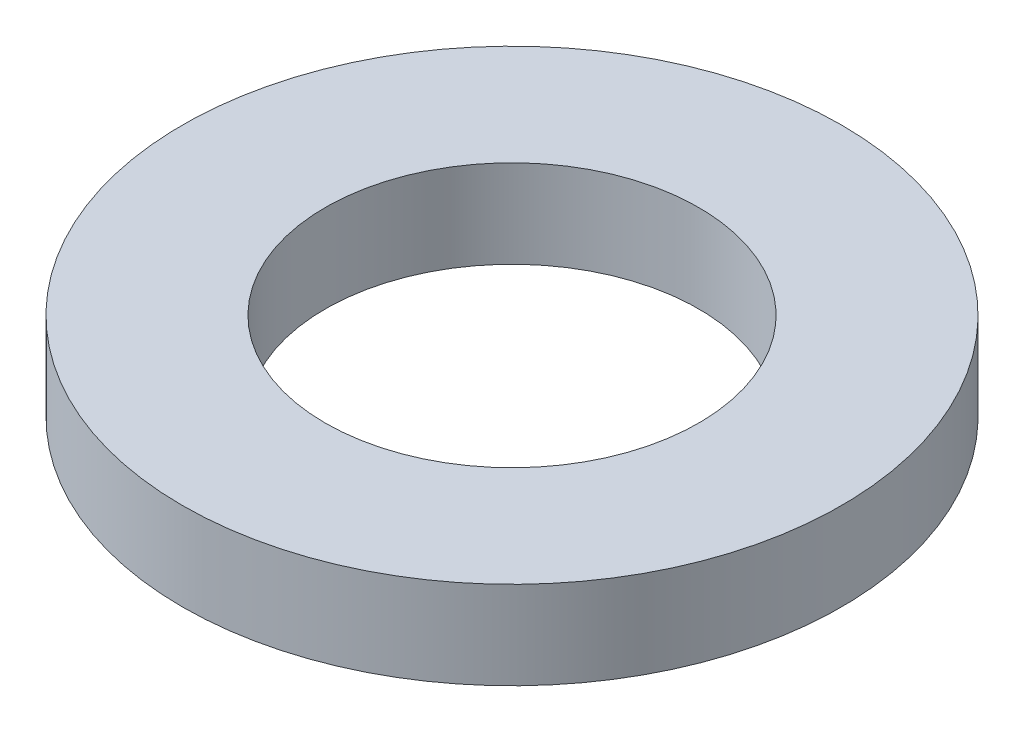
ISO-10303-21;
HEADER;
FILE_DESCRIPTION(('STEP AP214'),'2;1');
FILE_NAME('part.step','',(''),(''),'','','');
FILE_SCHEMA(('AUTOMOTIVE_DESIGN { 1 0 10303 214 1 1 1 1 }'));
ENDSEC;
DATA;
#1=APPLICATION_CONTEXT('core data for automotive mechanical design processes');
#2=APPLICATION_PROTOCOL_DEFINITION('international standard','automotive_design',2000,#1);
#3=PRODUCT_CONTEXT('',#1,'mechanical');
#4=PRODUCT('Part','Part','',(#3));
#5=PRODUCT_RELATED_PRODUCT_CATEGORY('part','',(#4));
#6=PRODUCT_DEFINITION_FORMATION('','',#4);
#7=PRODUCT_DEFINITION_CONTEXT('part definition',#1,'design');
#8=PRODUCT_DEFINITION('design','',#6,#7);
#9=PRODUCT_DEFINITION_SHAPE('','',#8);
#10=(LENGTH_UNIT() NAMED_UNIT(*) SI_UNIT(.MILLI.,.METRE.));
#11=(NAMED_UNIT(*) PLANE_ANGLE_UNIT() SI_UNIT($,.RADIAN.));
#12=(NAMED_UNIT(*) SI_UNIT($,.STERADIAN.) SOLID_ANGLE_UNIT());
#13=UNCERTAINTY_MEASURE_WITH_UNIT(LENGTH_MEASURE(1.E-05),#10,'distance_accuracy_value','');
#14=(GEOMETRIC_REPRESENTATION_CONTEXT(3) GLOBAL_UNCERTAINTY_ASSIGNED_CONTEXT((#13)) GLOBAL_UNIT_ASSIGNED_CONTEXT((#10,
#11,#12)) REPRESENTATION_CONTEXT('',''));
#15=CARTESIAN_POINT('',(0.,0.,0.));
#16=DIRECTION('',(0.,0.,1.));
#17=DIRECTION('',(1.,0.,0.));
#18=AXIS2_PLACEMENT_3D('',#15,#16,#17);
#19=CARTESIAN_POINT('',(0.,4.,0.));
#20=DIRECTION('',(0.,1.,0.));
#21=DIRECTION('',(0.,0.,1.));
#22=AXIS2_PLACEMENT_3D('',#19,#20,#21);
#23=PLANE('',#22);
#24=CARTESIAN_POINT('',(0.,4.,0.));
#25=DIRECTION('',(0.,1.,0.));
#26=DIRECTION('',(0.,0.,1.));
#27=AXIS2_PLACEMENT_3D('',#24,#25,#26);
#28=CIRCLE('',#27,15.);
#29=CARTESIAN_POINT('',(0.,4.,15.));
#30=VERTEX_POINT('',#29);
#31=EDGE_CURVE('E10',#30,#30,#28,.T.);
#32=ORIENTED_EDGE('',*,*,#31,.T.);
#33=EDGE_LOOP('',(#32));
#34=FACE_BOUND('',#33,.T.);
#35=CARTESIAN_POINT('',(0.,4.,0.));
#36=DIRECTION('',(0.,1.,0.));
#37=DIRECTION('',(0.,0.,1.));
#38=AXIS2_PLACEMENT_3D('',#35,#36,#37);
#39=CIRCLE('',#38,8.5);
#40=CARTESIAN_POINT('',(0.,4.,8.5));
#41=VERTEX_POINT('',#40);
#42=EDGE_CURVE('E44',#41,#41,#39,.T.);
#43=ORIENTED_EDGE('',*,*,#42,.F.);
#44=EDGE_LOOP('',(#43));
#45=FACE_BOUND('',#44,.T.);
#46=ADVANCED_FACE('F33',(#34,#45),#23,.T.);
#47=CARTESIAN_POINT('',(0.,0.,0.));
#48=DIRECTION('',(0.,1.,0.));
#49=DIRECTION('',(0.,0.,1.));
#50=AXIS2_PLACEMENT_3D('',#47,#48,#49);
#51=PLANE('',#50);
#52=CARTESIAN_POINT('',(0.,0.,0.));
#53=DIRECTION('',(0.,1.,0.));
#54=DIRECTION('',(0.,0.,1.));
#55=AXIS2_PLACEMENT_3D('',#52,#53,#54);
#56=CIRCLE('',#55,15.);
#57=CARTESIAN_POINT('',(0.,0.,15.));
#58=VERTEX_POINT('',#57);
#59=EDGE_CURVE('E37',#58,#58,#56,.T.);
#60=ORIENTED_EDGE('',*,*,#59,.F.);
#61=EDGE_LOOP('',(#60));
#62=FACE_BOUND('',#61,.T.);
#63=CARTESIAN_POINT('',(0.,0.,0.));
#64=DIRECTION('',(0.,1.,0.));
#65=DIRECTION('',(0.,0.,1.));
#66=AXIS2_PLACEMENT_3D('',#63,#64,#65);
#67=CIRCLE('',#66,8.5);
#68=CARTESIAN_POINT('',(0.,0.,8.5));
#69=VERTEX_POINT('',#68);
#70=EDGE_CURVE('E46',#69,#69,#67,.T.);
#71=ORIENTED_EDGE('',*,*,#70,.T.);
#72=EDGE_LOOP('',(#71));
#73=FACE_BOUND('',#72,.T.);
#74=ADVANCED_FACE('F56',(#62,#73),#51,.F.);
#75=CARTESIAN_POINT('',(0.,4.,0.));
#76=DIRECTION('',(0.,-1.,0.));
#77=DIRECTION('',(0.,0.,-1.));
#78=AXIS2_PLACEMENT_3D('',#75,#76,#77);
#79=CYLINDRICAL_SURFACE('',#78,15.);
#80=ORIENTED_EDGE('',*,*,#31,.F.);
#81=EDGE_LOOP('',(#80));
#82=FACE_BOUND('',#81,.T.);
#83=ORIENTED_EDGE('',*,*,#59,.T.);
#84=EDGE_LOOP('',(#83));
#85=FACE_BOUND('',#84,.T.);
#86=ADVANCED_FACE('F35',(#82,#85),#79,.T.);
#87=CARTESIAN_POINT('',(0.,4.,0.));
#88=DIRECTION('',(0.,-1.,0.));
#89=DIRECTION('',(0.,0.,-1.));
#90=AXIS2_PLACEMENT_3D('',#87,#88,#89);
#91=CYLINDRICAL_SURFACE('',#90,8.5);
#92=ORIENTED_EDGE('',*,*,#42,.T.);
#93=EDGE_LOOP('',(#92));
#94=FACE_BOUND('',#93,.T.);
#95=ORIENTED_EDGE('',*,*,#70,.F.);
#96=EDGE_LOOP('',(#95));
#97=FACE_BOUND('',#96,.T.);
#98=ADVANCED_FACE('F52',(#94,#97),#91,.F.);
#99=CLOSED_SHELL('',(#46,#74,#86,#98));
#100=MANIFOLD_SOLID_BREP('B2',#99);
#101=ADVANCED_BREP_SHAPE_REPRESENTATION('',(#18,#100),#14);
#102=SHAPE_DEFINITION_REPRESENTATION(#9,#101);
ENDSEC;
END-ISO-10303-21;
